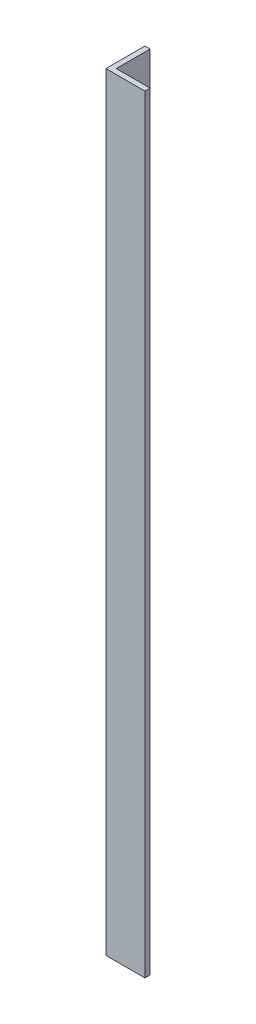
ISO-10303-21;
HEADER;
FILE_DESCRIPTION(('STEP AP214'),'2;1');
FILE_NAME('part.step','',(''),(''),'','','');
FILE_SCHEMA(('AUTOMOTIVE_DESIGN { 1 0 10303 214 1 1 1 1 }'));
ENDSEC;
DATA;
#1=APPLICATION_CONTEXT('core data for automotive mechanical design processes');
#2=APPLICATION_PROTOCOL_DEFINITION('international standard','automotive_design',2000,#1);
#3=PRODUCT_CONTEXT('',#1,'mechanical');
#4=PRODUCT('Part','Part','',(#3));
#5=PRODUCT_RELATED_PRODUCT_CATEGORY('part','',(#4));
#6=PRODUCT_DEFINITION_FORMATION('','',#4);
#7=PRODUCT_DEFINITION_CONTEXT('part definition',#1,'design');
#8=PRODUCT_DEFINITION('design','',#6,#7);
#9=PRODUCT_DEFINITION_SHAPE('','',#8);
#10=(LENGTH_UNIT() NAMED_UNIT(*) SI_UNIT(.MILLI.,.METRE.));
#11=(NAMED_UNIT(*) PLANE_ANGLE_UNIT() SI_UNIT($,.RADIAN.));
#12=(NAMED_UNIT(*) SI_UNIT($,.STERADIAN.) SOLID_ANGLE_UNIT());
#13=UNCERTAINTY_MEASURE_WITH_UNIT(LENGTH_MEASURE(1.E-05),#10,'distance_accuracy_value','');
#14=(GEOMETRIC_REPRESENTATION_CONTEXT(3) GLOBAL_UNCERTAINTY_ASSIGNED_CONTEXT((#13)) GLOBAL_UNIT_ASSIGNED_CONTEXT((#10,
#11,#12)) REPRESENTATION_CONTEXT('',''));
#15=CARTESIAN_POINT('',(0.,0.,0.));
#16=DIRECTION('',(0.,0.,1.));
#17=DIRECTION('',(1.,0.,0.));
#18=AXIS2_PLACEMENT_3D('',#15,#16,#17);
#19=CARTESIAN_POINT('',(0.,295.,-15.));
#20=DIRECTION('',(1.,0.,0.));
#21=DIRECTION('',(0.,0.,-1.));
#22=AXIS2_PLACEMENT_3D('',#19,#20,#21);
#23=PLANE('',#22);
#24=DIRECTION('',(0.,0.,1.));
#25=VECTOR('',#24,1.);
#26=CARTESIAN_POINT('',(0.,0.,-15.));
#27=LINE('',#26,#25);
#28=CARTESIAN_POINT('',(0.,0.,-15.));
#29=VERTEX_POINT('',#28);
#30=CARTESIAN_POINT('',(0.,0.,0.));
#31=VERTEX_POINT('',#30);
#32=EDGE_CURVE('E117',#29,#31,#27,.T.);
#33=ORIENTED_EDGE('',*,*,#32,.T.);
#34=DIRECTION('',(0.,-1.,0.));
#35=VECTOR('',#34,1.);
#36=CARTESIAN_POINT('',(0.,295.,0.));
#37=LINE('',#36,#35);
#38=CARTESIAN_POINT('',(0.,295.,0.));
#39=VERTEX_POINT('',#38);
#40=EDGE_CURVE('E11',#39,#31,#37,.T.);
#41=ORIENTED_EDGE('',*,*,#40,.F.);
#42=DIRECTION('',(0.,0.,1.));
#43=VECTOR('',#42,1.);
#44=CARTESIAN_POINT('',(0.,295.,-15.));
#45=LINE('',#44,#43);
#46=CARTESIAN_POINT('',(0.,295.,-15.));
#47=VERTEX_POINT('',#46);
#48=EDGE_CURVE('E127',#47,#39,#45,.T.);
#49=ORIENTED_EDGE('',*,*,#48,.F.);
#50=DIRECTION('',(0.,-1.,0.));
#51=VECTOR('',#50,1.);
#52=CARTESIAN_POINT('',(0.,295.,-15.));
#53=LINE('',#52,#51);
#54=EDGE_CURVE('E113',#47,#29,#53,.T.);
#55=ORIENTED_EDGE('',*,*,#54,.T.);
#56=EDGE_LOOP('',(#33,#41,#49,#55));
#57=FACE_BOUND('',#56,.T.);
#58=ADVANCED_FACE('F33',(#57),#23,.F.);
#59=CARTESIAN_POINT('',(0.,295.,0.));
#60=DIRECTION('',(0.,0.,-1.));
#61=DIRECTION('',(-1.,0.,0.));
#62=AXIS2_PLACEMENT_3D('',#59,#60,#61);
#63=PLANE('',#62);
#64=DIRECTION('',(1.,0.,0.));
#65=VECTOR('',#64,1.);
#66=CARTESIAN_POINT('',(0.,0.,0.));
#67=LINE('',#66,#65);
#68=CARTESIAN_POINT('',(15.,0.,0.));
#69=VERTEX_POINT('',#68);
#70=EDGE_CURVE('E120',#31,#69,#67,.T.);
#71=ORIENTED_EDGE('',*,*,#70,.T.);
#72=DIRECTION('',(0.,-1.,0.));
#73=VECTOR('',#72,1.);
#74=CARTESIAN_POINT('',(15.,295.,0.));
#75=LINE('',#74,#73);
#76=CARTESIAN_POINT('',(15.,295.,0.));
#77=VERTEX_POINT('',#76);
#78=EDGE_CURVE('E41',#77,#69,#75,.T.);
#79=ORIENTED_EDGE('',*,*,#78,.F.);
#80=DIRECTION('',(1.,0.,0.));
#81=VECTOR('',#80,1.);
#82=CARTESIAN_POINT('',(0.,295.,0.));
#83=LINE('',#82,#81);
#84=EDGE_CURVE('E86',#39,#77,#83,.T.);
#85=ORIENTED_EDGE('',*,*,#84,.F.);
#86=ORIENTED_EDGE('',*,*,#40,.T.);
#87=EDGE_LOOP('',(#71,#79,#85,#86));
#88=FACE_BOUND('',#87,.T.);
#89=ADVANCED_FACE('F151',(#88),#63,.F.);
#90=CARTESIAN_POINT('',(15.,295.,0.));
#91=DIRECTION('',(-1.,0.,0.));
#92=DIRECTION('',(0.,0.,1.));
#93=AXIS2_PLACEMENT_3D('',#90,#91,#92);
#94=PLANE('',#93);
#95=DIRECTION('',(0.,0.,-1.));
#96=VECTOR('',#95,1.);
#97=CARTESIAN_POINT('',(15.,0.,0.));
#98=LINE('',#97,#96);
#99=CARTESIAN_POINT('',(15.,0.,-2.));
#100=VERTEX_POINT('',#99);
#101=EDGE_CURVE('E122',#69,#100,#98,.T.);
#102=ORIENTED_EDGE('',*,*,#101,.T.);
#103=DIRECTION('',(0.,-1.,0.));
#104=VECTOR('',#103,1.);
#105=CARTESIAN_POINT('',(15.,295.,-2.));
#106=LINE('',#105,#104);
#107=CARTESIAN_POINT('',(15.,295.,-2.));
#108=VERTEX_POINT('',#107);
#109=EDGE_CURVE('E108',#108,#100,#106,.T.);
#110=ORIENTED_EDGE('',*,*,#109,.F.);
#111=DIRECTION('',(0.,0.,-1.));
#112=VECTOR('',#111,1.);
#113=CARTESIAN_POINT('',(15.,295.,0.));
#114=LINE('',#113,#112);
#115=EDGE_CURVE('E99',#77,#108,#114,.T.);
#116=ORIENTED_EDGE('',*,*,#115,.F.);
#117=ORIENTED_EDGE('',*,*,#78,.T.);
#118=EDGE_LOOP('',(#102,#110,#116,#117));
#119=FACE_BOUND('',#118,.T.);
#120=ADVANCED_FACE('F133',(#119),#94,.F.);
#121=CARTESIAN_POINT('',(15.,295.,-2.));
#122=DIRECTION('',(0.,0.,1.));
#123=DIRECTION('',(1.,0.,0.));
#124=AXIS2_PLACEMENT_3D('',#121,#122,#123);
#125=PLANE('',#124);
#126=DIRECTION('',(-1.,0.,0.));
#127=VECTOR('',#126,1.);
#128=CARTESIAN_POINT('',(15.,0.,-2.));
#129=LINE('',#128,#127);
#130=CARTESIAN_POINT('',(2.,0.,-2.));
#131=VERTEX_POINT('',#130);
#132=EDGE_CURVE('E107',#100,#131,#129,.T.);
#133=ORIENTED_EDGE('',*,*,#132,.T.);
#134=DIRECTION('',(0.,-1.,0.));
#135=VECTOR('',#134,1.);
#136=CARTESIAN_POINT('',(2.,295.,-2.));
#137=LINE('',#136,#135);
#138=CARTESIAN_POINT('',(2.,295.,-2.));
#139=VERTEX_POINT('',#138);
#140=EDGE_CURVE('E104',#139,#131,#137,.T.);
#141=ORIENTED_EDGE('',*,*,#140,.F.);
#142=DIRECTION('',(-1.,0.,0.));
#143=VECTOR('',#142,1.);
#144=CARTESIAN_POINT('',(15.,295.,-2.));
#145=LINE('',#144,#143);
#146=EDGE_CURVE('E93',#108,#139,#145,.T.);
#147=ORIENTED_EDGE('',*,*,#146,.F.);
#148=ORIENTED_EDGE('',*,*,#109,.T.);
#149=EDGE_LOOP('',(#133,#141,#147,#148));
#150=FACE_BOUND('',#149,.T.);
#151=ADVANCED_FACE('F105',(#150),#125,.F.);
#152=CARTESIAN_POINT('',(2.,295.,-2.));
#153=DIRECTION('',(-1.,0.,0.));
#154=DIRECTION('',(0.,0.,1.));
#155=AXIS2_PLACEMENT_3D('',#152,#153,#154);
#156=PLANE('',#155);
#157=DIRECTION('',(0.,0.,-1.));
#158=VECTOR('',#157,1.);
#159=CARTESIAN_POINT('',(2.,0.,-2.));
#160=LINE('',#159,#158);
#161=CARTESIAN_POINT('',(2.,0.,-15.));
#162=VERTEX_POINT('',#161);
#163=EDGE_CURVE('E72',#131,#162,#160,.T.);
#164=ORIENTED_EDGE('',*,*,#163,.T.);
#165=DIRECTION('',(0.,-1.,0.));
#166=VECTOR('',#165,1.);
#167=CARTESIAN_POINT('',(2.,295.,-15.));
#168=LINE('',#167,#166);
#169=CARTESIAN_POINT('',(2.,295.,-15.));
#170=VERTEX_POINT('',#169);
#171=EDGE_CURVE('E109',#170,#162,#168,.T.);
#172=ORIENTED_EDGE('',*,*,#171,.F.);
#173=DIRECTION('',(0.,0.,-1.));
#174=VECTOR('',#173,1.);
#175=CARTESIAN_POINT('',(2.,295.,-2.));
#176=LINE('',#175,#174);
#177=EDGE_CURVE('E97',#139,#170,#176,.T.);
#178=ORIENTED_EDGE('',*,*,#177,.F.);
#179=ORIENTED_EDGE('',*,*,#140,.T.);
#180=EDGE_LOOP('',(#164,#172,#178,#179));
#181=FACE_BOUND('',#180,.T.);
#182=ADVANCED_FACE('F111',(#181),#156,.F.);
#183=CARTESIAN_POINT('',(2.,295.,-15.));
#184=DIRECTION('',(0.,0.,1.));
#185=DIRECTION('',(1.,0.,0.));
#186=AXIS2_PLACEMENT_3D('',#183,#184,#185);
#187=PLANE('',#186);
#188=DIRECTION('',(-1.,0.,0.));
#189=VECTOR('',#188,1.);
#190=CARTESIAN_POINT('',(2.,0.,-15.));
#191=LINE('',#190,#189);
#192=EDGE_CURVE('E78',#162,#29,#191,.T.);
#193=ORIENTED_EDGE('',*,*,#192,.T.);
#194=ORIENTED_EDGE('',*,*,#54,.F.);
#195=DIRECTION('',(-1.,0.,0.));
#196=VECTOR('',#195,1.);
#197=CARTESIAN_POINT('',(2.,295.,-15.));
#198=LINE('',#197,#196);
#199=EDGE_CURVE('E49',#170,#47,#198,.T.);
#200=ORIENTED_EDGE('',*,*,#199,.F.);
#201=ORIENTED_EDGE('',*,*,#171,.T.);
#202=EDGE_LOOP('',(#193,#194,#200,#201));
#203=FACE_BOUND('',#202,.T.);
#204=ADVANCED_FACE('F140',(#203),#187,.F.);
#205=CARTESIAN_POINT('',(0.,295.,0.));
#206=DIRECTION('',(0.,1.,0.));
#207=DIRECTION('',(0.,0.,1.));
#208=AXIS2_PLACEMENT_3D('',#205,#206,#207);
#209=PLANE('',#208);
#210=ORIENTED_EDGE('',*,*,#48,.T.);
#211=ORIENTED_EDGE('',*,*,#84,.T.);
#212=ORIENTED_EDGE('',*,*,#115,.T.);
#213=ORIENTED_EDGE('',*,*,#146,.T.);
#214=ORIENTED_EDGE('',*,*,#177,.T.);
#215=ORIENTED_EDGE('',*,*,#199,.T.);
#216=EDGE_LOOP('',(#210,#211,#212,#213,#214,#215));
#217=FACE_BOUND('',#216,.T.);
#218=ADVANCED_FACE('F95',(#217),#209,.T.);
#219=CARTESIAN_POINT('',(0.,0.,0.));
#220=DIRECTION('',(0.,1.,0.));
#221=DIRECTION('',(0.,0.,1.));
#222=AXIS2_PLACEMENT_3D('',#219,#220,#221);
#223=PLANE('',#222);
#224=ORIENTED_EDGE('',*,*,#32,.F.);
#225=ORIENTED_EDGE('',*,*,#192,.F.);
#226=ORIENTED_EDGE('',*,*,#163,.F.);
#227=ORIENTED_EDGE('',*,*,#132,.F.);
#228=ORIENTED_EDGE('',*,*,#101,.F.);
#229=ORIENTED_EDGE('',*,*,#70,.F.);
#230=EDGE_LOOP('',(#224,#225,#226,#227,#228,#229));
#231=FACE_BOUND('',#230,.T.);
#232=ADVANCED_FACE('F136',(#231),#223,.F.);
#233=CLOSED_SHELL('',(#58,#89,#120,#151,#182,#204,#218,#232));
#234=MANIFOLD_SOLID_BREP('B2',#233);
#235=ADVANCED_BREP_SHAPE_REPRESENTATION('',(#18,#234),#14);
#236=SHAPE_DEFINITION_REPRESENTATION(#9,#235);
ENDSEC;
END-ISO-10303-21;
